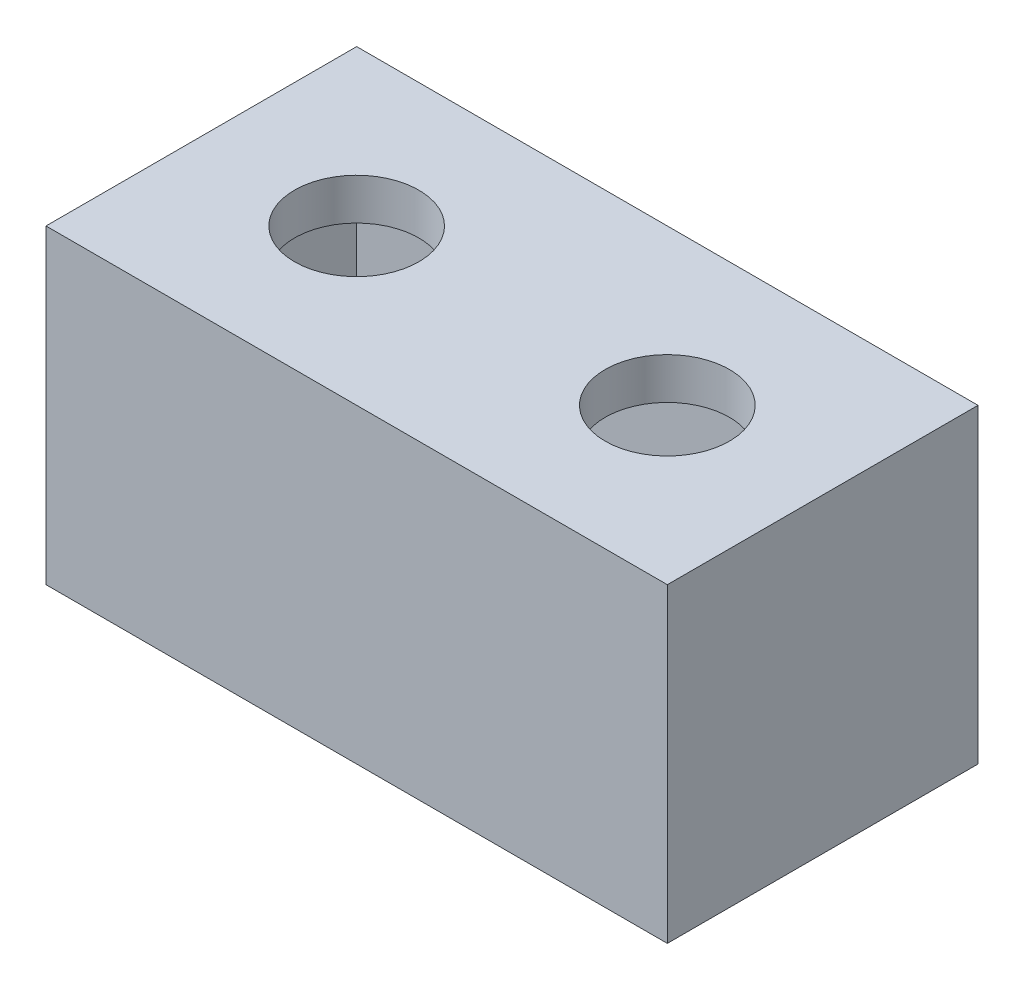
ISO-10303-21;
HEADER;
FILE_DESCRIPTION(('STEP AP214'),'2;1');
FILE_NAME('part.step','',(''),(''),'','','');
FILE_SCHEMA(('AUTOMOTIVE_DESIGN { 1 0 10303 214 1 1 1 1 }'));
ENDSEC;
DATA;
#1=APPLICATION_CONTEXT('core data for automotive mechanical design processes');
#2=APPLICATION_PROTOCOL_DEFINITION('international standard','automotive_design',2000,#1);
#3=PRODUCT_CONTEXT('',#1,'mechanical');
#4=PRODUCT('Part','Part','',(#3));
#5=PRODUCT_RELATED_PRODUCT_CATEGORY('part','',(#4));
#6=PRODUCT_DEFINITION_FORMATION('','',#4);
#7=PRODUCT_DEFINITION_CONTEXT('part definition',#1,'design');
#8=PRODUCT_DEFINITION('design','',#6,#7);
#9=PRODUCT_DEFINITION_SHAPE('','',#8);
#10=(LENGTH_UNIT() NAMED_UNIT(*) SI_UNIT(.MILLI.,.METRE.));
#11=(NAMED_UNIT(*) PLANE_ANGLE_UNIT() SI_UNIT($,.RADIAN.));
#12=(NAMED_UNIT(*) SI_UNIT($,.STERADIAN.) SOLID_ANGLE_UNIT());
#13=UNCERTAINTY_MEASURE_WITH_UNIT(LENGTH_MEASURE(1.E-05),#10,'distance_accuracy_value','');
#14=(GEOMETRIC_REPRESENTATION_CONTEXT(3) GLOBAL_UNCERTAINTY_ASSIGNED_CONTEXT((#13)) GLOBAL_UNIT_ASSIGNED_CONTEXT((#10,
#11,#12)) REPRESENTATION_CONTEXT('',''));
#15=CARTESIAN_POINT('',(0.,0.,0.));
#16=DIRECTION('',(0.,0.,1.));
#17=DIRECTION('',(1.,0.,0.));
#18=AXIS2_PLACEMENT_3D('',#15,#16,#17);
#19=CARTESIAN_POINT('',(0.,15.,0.));
#20=DIRECTION('',(-1.,0.,0.));
#21=DIRECTION('',(0.,0.,1.));
#22=AXIS2_PLACEMENT_3D('',#19,#20,#21);
#23=PLANE('',#22);
#24=DIRECTION('',(0.,0.,-1.));
#25=VECTOR('',#24,1.);
#26=CARTESIAN_POINT('',(0.,0.,0.));
#27=LINE('',#26,#25);
#28=CARTESIAN_POINT('',(0.,0.,0.));
#29=VERTEX_POINT('',#28);
#30=CARTESIAN_POINT('',(0.,0.,-15.));
#31=VERTEX_POINT('',#30);
#32=EDGE_CURVE('E128',#29,#31,#27,.T.);
#33=ORIENTED_EDGE('',*,*,#32,.F.);
#34=DIRECTION('',(0.,-1.,0.));
#35=VECTOR('',#34,1.);
#36=CARTESIAN_POINT('',(0.,15.,0.));
#37=LINE('',#36,#35);
#38=CARTESIAN_POINT('',(0.,15.,0.));
#39=VERTEX_POINT('',#38);
#40=EDGE_CURVE('E40',#39,#29,#37,.T.);
#41=ORIENTED_EDGE('',*,*,#40,.F.);
#42=DIRECTION('',(0.,0.,-1.));
#43=VECTOR('',#42,1.);
#44=CARTESIAN_POINT('',(0.,15.,0.));
#45=LINE('',#44,#43);
#46=CARTESIAN_POINT('',(0.,15.,-15.));
#47=VERTEX_POINT('',#46);
#48=EDGE_CURVE('E138',#39,#47,#45,.T.);
#49=ORIENTED_EDGE('',*,*,#48,.T.);
#50=DIRECTION('',(0.,-1.,0.));
#51=VECTOR('',#50,1.);
#52=CARTESIAN_POINT('',(0.,15.,-15.));
#53=LINE('',#52,#51);
#54=EDGE_CURVE('E145',#47,#31,#53,.T.);
#55=ORIENTED_EDGE('',*,*,#54,.T.);
#56=EDGE_LOOP('',(#33,#41,#49,#55));
#57=FACE_BOUND('',#56,.T.);
#58=ADVANCED_FACE('F33',(#57),#23,.T.);
#59=CARTESIAN_POINT('',(0.,15.,0.));
#60=DIRECTION('',(0.,0.,-1.));
#61=DIRECTION('',(-1.,0.,0.));
#62=AXIS2_PLACEMENT_3D('',#59,#60,#61);
#63=PLANE('',#62);
#64=DIRECTION('',(1.,0.,0.));
#65=VECTOR('',#64,1.);
#66=CARTESIAN_POINT('',(0.,0.,0.));
#67=LINE('',#66,#65);
#68=CARTESIAN_POINT('',(30.,0.,0.));
#69=VERTEX_POINT('',#68);
#70=EDGE_CURVE('E132',#29,#69,#67,.T.);
#71=ORIENTED_EDGE('',*,*,#70,.T.);
#72=DIRECTION('',(0.,-1.,0.));
#73=VECTOR('',#72,1.);
#74=CARTESIAN_POINT('',(30.,15.,0.));
#75=LINE('',#74,#73);
#76=CARTESIAN_POINT('',(30.,15.,0.));
#77=VERTEX_POINT('',#76);
#78=EDGE_CURVE('E140',#77,#69,#75,.T.);
#79=ORIENTED_EDGE('',*,*,#78,.F.);
#80=DIRECTION('',(1.,0.,0.));
#81=VECTOR('',#80,1.);
#82=CARTESIAN_POINT('',(0.,15.,0.));
#83=LINE('',#82,#81);
#84=EDGE_CURVE('E147',#39,#77,#83,.T.);
#85=ORIENTED_EDGE('',*,*,#84,.F.);
#86=ORIENTED_EDGE('',*,*,#40,.T.);
#87=EDGE_LOOP('',(#71,#79,#85,#86));
#88=FACE_BOUND('',#87,.T.);
#89=ADVANCED_FACE('F194',(#88),#63,.F.);
#90=CARTESIAN_POINT('',(30.,15.,0.));
#91=DIRECTION('',(-1.,0.,0.));
#92=DIRECTION('',(0.,0.,1.));
#93=AXIS2_PLACEMENT_3D('',#90,#91,#92);
#94=PLANE('',#93);
#95=DIRECTION('',(0.,0.,-1.));
#96=VECTOR('',#95,1.);
#97=CARTESIAN_POINT('',(30.,0.,0.));
#98=LINE('',#97,#96);
#99=CARTESIAN_POINT('',(30.,0.,-15.));
#100=VERTEX_POINT('',#99);
#101=EDGE_CURVE('E129',#69,#100,#98,.T.);
#102=ORIENTED_EDGE('',*,*,#101,.T.);
#103=DIRECTION('',(0.,-1.,0.));
#104=VECTOR('',#103,1.);
#105=CARTESIAN_POINT('',(30.,15.,-15.));
#106=LINE('',#105,#104);
#107=CARTESIAN_POINT('',(30.,15.,-15.));
#108=VERTEX_POINT('',#107);
#109=EDGE_CURVE('E143',#108,#100,#106,.T.);
#110=ORIENTED_EDGE('',*,*,#109,.F.);
#111=DIRECTION('',(0.,0.,-1.));
#112=VECTOR('',#111,1.);
#113=CARTESIAN_POINT('',(30.,15.,0.));
#114=LINE('',#113,#112);
#115=EDGE_CURVE('E184',#77,#108,#114,.T.);
#116=ORIENTED_EDGE('',*,*,#115,.F.);
#117=ORIENTED_EDGE('',*,*,#78,.T.);
#118=EDGE_LOOP('',(#102,#110,#116,#117));
#119=FACE_BOUND('',#118,.T.);
#120=ADVANCED_FACE('F197',(#119),#94,.F.);
#121=CARTESIAN_POINT('',(0.,15.,-15.));
#122=DIRECTION('',(0.,0.,-1.));
#123=DIRECTION('',(-1.,0.,0.));
#124=AXIS2_PLACEMENT_3D('',#121,#122,#123);
#125=PLANE('',#124);
#126=CARTESIAN_POINT('',(15.,0.,-15.));
#127=DIRECTION('',(0.,0.,-1.));
#128=DIRECTION('',(-1.,0.,0.));
#129=AXIS2_PLACEMENT_3D('',#126,#127,#128);
#130=CIRCLE('',#129,5.);
#131=CARTESIAN_POINT('',(10.,0.,-15.));
#132=VERTEX_POINT('',#131);
#133=CARTESIAN_POINT('',(20.,0.,-15.));
#134=VERTEX_POINT('',#133);
#135=EDGE_CURVE('E109',#132,#134,#130,.T.);
#136=ORIENTED_EDGE('',*,*,#135,.F.);
#137=DIRECTION('',(1.,0.,0.));
#138=VECTOR('',#137,1.);
#139=CARTESIAN_POINT('',(0.,0.,-15.));
#140=LINE('',#139,#138);
#141=EDGE_CURVE('E120',#31,#132,#140,.T.);
#142=ORIENTED_EDGE('',*,*,#141,.F.);
#143=ORIENTED_EDGE('',*,*,#54,.F.);
#144=DIRECTION('',(1.,0.,0.));
#145=VECTOR('',#144,1.);
#146=CARTESIAN_POINT('',(0.,15.,-15.));
#147=LINE('',#146,#145);
#148=EDGE_CURVE('E181',#47,#108,#147,.T.);
#149=ORIENTED_EDGE('',*,*,#148,.T.);
#150=ORIENTED_EDGE('',*,*,#109,.T.);
#151=EDGE_CURVE('E123',#134,#100,#140,.T.);
#152=ORIENTED_EDGE('',*,*,#151,.F.);
#153=EDGE_LOOP('',(#136,#142,#143,#149,#150,#152));
#154=FACE_BOUND('',#153,.T.);
#155=ADVANCED_FACE('F119',(#154),#125,.T.);
#156=CARTESIAN_POINT('',(0.,15.,0.));
#157=DIRECTION('',(0.,-1.,0.));
#158=DIRECTION('',(0.,0.,-1.));
#159=AXIS2_PLACEMENT_3D('',#156,#157,#158);
#160=PLANE('',#159);
#161=CARTESIAN_POINT('',(7.5,15.,-7.5));
#162=DIRECTION('',(0.,1.,0.));
#163=DIRECTION('',(0.,0.,1.));
#164=AXIS2_PLACEMENT_3D('',#161,#162,#163);
#165=CIRCLE('',#164,3.);
#166=CARTESIAN_POINT('',(7.5,15.,-4.5));
#167=VERTEX_POINT('',#166);
#168=EDGE_CURVE('E151',#167,#167,#165,.T.);
#169=ORIENTED_EDGE('',*,*,#168,.F.);
#170=EDGE_LOOP('',(#169));
#171=FACE_BOUND('',#170,.T.);
#172=CARTESIAN_POINT('',(22.5,15.,-7.5));
#173=DIRECTION('',(0.,1.,0.));
#174=DIRECTION('',(0.,0.,1.));
#175=AXIS2_PLACEMENT_3D('',#172,#173,#174);
#176=CIRCLE('',#175,3.);
#177=CARTESIAN_POINT('',(22.5,15.,-4.5));
#178=VERTEX_POINT('',#177);
#179=EDGE_CURVE('E114',#178,#178,#176,.T.);
#180=ORIENTED_EDGE('',*,*,#179,.F.);
#181=EDGE_LOOP('',(#180));
#182=FACE_BOUND('',#181,.T.);
#183=ORIENTED_EDGE('',*,*,#48,.F.);
#184=ORIENTED_EDGE('',*,*,#84,.T.);
#185=ORIENTED_EDGE('',*,*,#115,.T.);
#186=ORIENTED_EDGE('',*,*,#148,.F.);
#187=EDGE_LOOP('',(#183,#184,#185,#186));
#188=FACE_BOUND('',#187,.T.);
#189=ADVANCED_FACE('F189',(#171,#182,#188),#160,.F.);
#190=CARTESIAN_POINT('',(0.,0.,0.));
#191=DIRECTION('',(0.,-1.,0.));
#192=DIRECTION('',(0.,0.,-1.));
#193=AXIS2_PLACEMENT_3D('',#190,#191,#192);
#194=PLANE('',#193);
#195=DIRECTION('',(0.,0.,-1.));
#196=VECTOR('',#195,1.);
#197=CARTESIAN_POINT('',(10.,0.,-10.));
#198=LINE('',#197,#196);
#199=CARTESIAN_POINT('',(10.,0.,-13.));
#200=VERTEX_POINT('',#199);
#201=EDGE_CURVE('E106',#200,#132,#198,.T.);
#202=ORIENTED_EDGE('',*,*,#201,.F.);
#203=DIRECTION('',(1.,0.,0.));
#204=VECTOR('',#203,1.);
#205=CARTESIAN_POINT('',(2.,0.,-13.));
#206=LINE('',#205,#204);
#207=CARTESIAN_POINT('',(2.,0.,-13.));
#208=VERTEX_POINT('',#207);
#209=EDGE_CURVE('E157',#208,#200,#206,.T.);
#210=ORIENTED_EDGE('',*,*,#209,.F.);
#211=DIRECTION('',(0.,0.,-1.));
#212=VECTOR('',#211,1.);
#213=CARTESIAN_POINT('',(2.,0.,-2.));
#214=LINE('',#213,#212);
#215=CARTESIAN_POINT('',(2.,0.,-2.));
#216=VERTEX_POINT('',#215);
#217=EDGE_CURVE('E54',#216,#208,#214,.T.);
#218=ORIENTED_EDGE('',*,*,#217,.F.);
#219=DIRECTION('',(-1.,0.,0.));
#220=VECTOR('',#219,1.);
#221=CARTESIAN_POINT('',(2.,0.,-2.));
#222=LINE('',#221,#220);
#223=CARTESIAN_POINT('',(28.,0.,-2.));
#224=VERTEX_POINT('',#223);
#225=EDGE_CURVE('E166',#224,#216,#222,.T.);
#226=ORIENTED_EDGE('',*,*,#225,.F.);
#227=DIRECTION('',(0.,0.,1.));
#228=VECTOR('',#227,1.);
#229=CARTESIAN_POINT('',(28.,0.,-2.));
#230=LINE('',#229,#228);
#231=CARTESIAN_POINT('',(28.,0.,-13.));
#232=VERTEX_POINT('',#231);
#233=EDGE_CURVE('E163',#232,#224,#230,.T.);
#234=ORIENTED_EDGE('',*,*,#233,.F.);
#235=CARTESIAN_POINT('',(20.,0.,-13.));
#236=VERTEX_POINT('',#235);
#237=EDGE_CURVE('E155',#236,#232,#206,.T.);
#238=ORIENTED_EDGE('',*,*,#237,.F.);
#239=DIRECTION('',(0.,0.,-1.));
#240=VECTOR('',#239,1.);
#241=CARTESIAN_POINT('',(20.,0.,-10.));
#242=LINE('',#241,#240);
#243=EDGE_CURVE('E47',#134,#236,#242,.F.);
#244=ORIENTED_EDGE('',*,*,#243,.F.);
#245=ORIENTED_EDGE('',*,*,#151,.T.);
#246=ORIENTED_EDGE('',*,*,#101,.F.);
#247=ORIENTED_EDGE('',*,*,#70,.F.);
#248=ORIENTED_EDGE('',*,*,#32,.T.);
#249=ORIENTED_EDGE('',*,*,#141,.T.);
#250=EDGE_LOOP('',(#202,#210,#218,#226,#234,#238,#244,#245,#246,#247,#248,#249));
#251=FACE_BOUND('',#250,.T.);
#252=ADVANCED_FACE('F125',(#251),#194,.T.);
#253=CARTESIAN_POINT('',(2.,13.,-2.));
#254=DIRECTION('',(-1.,0.,0.));
#255=DIRECTION('',(0.,0.,1.));
#256=AXIS2_PLACEMENT_3D('',#253,#254,#255);
#257=PLANE('',#256);
#258=ORIENTED_EDGE('',*,*,#217,.T.);
#259=DIRECTION('',(0.,-1.,0.));
#260=VECTOR('',#259,1.);
#261=CARTESIAN_POINT('',(2.,13.,-13.));
#262=LINE('',#261,#260);
#263=CARTESIAN_POINT('',(2.,13.,-13.));
#264=VERTEX_POINT('',#263);
#265=EDGE_CURVE('E177',#264,#208,#262,.T.);
#266=ORIENTED_EDGE('',*,*,#265,.F.);
#267=DIRECTION('',(0.,0.,-1.));
#268=VECTOR('',#267,1.);
#269=CARTESIAN_POINT('',(2.,13.,-2.));
#270=LINE('',#269,#268);
#271=CARTESIAN_POINT('',(2.,13.,-2.));
#272=VERTEX_POINT('',#271);
#273=EDGE_CURVE('E169',#272,#264,#270,.T.);
#274=ORIENTED_EDGE('',*,*,#273,.F.);
#275=DIRECTION('',(0.,-1.,0.));
#276=VECTOR('',#275,1.);
#277=CARTESIAN_POINT('',(2.,13.,-2.));
#278=LINE('',#277,#276);
#279=EDGE_CURVE('E170',#272,#216,#278,.T.);
#280=ORIENTED_EDGE('',*,*,#279,.T.);
#281=EDGE_LOOP('',(#258,#266,#274,#280));
#282=FACE_BOUND('',#281,.T.);
#283=ADVANCED_FACE('F222',(#282),#257,.F.);
#284=CARTESIAN_POINT('',(2.,13.,-2.));
#285=DIRECTION('',(0.,0.,1.));
#286=DIRECTION('',(1.,0.,0.));
#287=AXIS2_PLACEMENT_3D('',#284,#285,#286);
#288=PLANE('',#287);
#289=ORIENTED_EDGE('',*,*,#225,.T.);
#290=ORIENTED_EDGE('',*,*,#279,.F.);
#291=DIRECTION('',(-1.,0.,0.));
#292=VECTOR('',#291,1.);
#293=CARTESIAN_POINT('',(2.,13.,-2.));
#294=LINE('',#293,#292);
#295=CARTESIAN_POINT('',(28.,13.,-2.));
#296=VERTEX_POINT('',#295);
#297=EDGE_CURVE('E160',#296,#272,#294,.T.);
#298=ORIENTED_EDGE('',*,*,#297,.F.);
#299=DIRECTION('',(0.,-1.,0.));
#300=VECTOR('',#299,1.);
#301=CARTESIAN_POINT('',(28.,13.,-2.));
#302=LINE('',#301,#300);
#303=EDGE_CURVE('E172',#296,#224,#302,.T.);
#304=ORIENTED_EDGE('',*,*,#303,.T.);
#305=EDGE_LOOP('',(#289,#290,#298,#304));
#306=FACE_BOUND('',#305,.T.);
#307=ADVANCED_FACE('F220',(#306),#288,.F.);
#308=CARTESIAN_POINT('',(28.,13.,-2.));
#309=DIRECTION('',(1.,0.,0.));
#310=DIRECTION('',(0.,0.,-1.));
#311=AXIS2_PLACEMENT_3D('',#308,#309,#310);
#312=PLANE('',#311);
#313=ORIENTED_EDGE('',*,*,#233,.T.);
#314=ORIENTED_EDGE('',*,*,#303,.F.);
#315=DIRECTION('',(0.,0.,1.));
#316=VECTOR('',#315,1.);
#317=CARTESIAN_POINT('',(28.,13.,-2.));
#318=LINE('',#317,#316);
#319=CARTESIAN_POINT('',(28.,13.,-13.));
#320=VERTEX_POINT('',#319);
#321=EDGE_CURVE('E211',#320,#296,#318,.T.);
#322=ORIENTED_EDGE('',*,*,#321,.F.);
#323=DIRECTION('',(0.,-1.,0.));
#324=VECTOR('',#323,1.);
#325=CARTESIAN_POINT('',(28.,13.,-13.));
#326=LINE('',#325,#324);
#327=EDGE_CURVE('E174',#320,#232,#326,.T.);
#328=ORIENTED_EDGE('',*,*,#327,.T.);
#329=EDGE_LOOP('',(#313,#314,#322,#328));
#330=FACE_BOUND('',#329,.T.);
#331=ADVANCED_FACE('F227',(#330),#312,.F.);
#332=CARTESIAN_POINT('',(2.,13.,-13.));
#333=DIRECTION('',(0.,0.,-1.));
#334=DIRECTION('',(-1.,0.,0.));
#335=AXIS2_PLACEMENT_3D('',#332,#333,#334);
#336=PLANE('',#335);
#337=ORIENTED_EDGE('',*,*,#209,.T.);
#338=CARTESIAN_POINT('',(15.,0.,-13.));
#339=DIRECTION('',(0.,0.,-1.));
#340=DIRECTION('',(-1.,0.,0.));
#341=AXIS2_PLACEMENT_3D('',#338,#339,#340);
#342=CIRCLE('',#341,5.);
#343=EDGE_CURVE('E11',#200,#236,#342,.T.);
#344=ORIENTED_EDGE('',*,*,#343,.T.);
#345=ORIENTED_EDGE('',*,*,#237,.T.);
#346=ORIENTED_EDGE('',*,*,#327,.F.);
#347=DIRECTION('',(1.,0.,0.));
#348=VECTOR('',#347,1.);
#349=CARTESIAN_POINT('',(2.,13.,-13.));
#350=LINE('',#349,#348);
#351=EDGE_CURVE('E209',#264,#320,#350,.T.);
#352=ORIENTED_EDGE('',*,*,#351,.F.);
#353=ORIENTED_EDGE('',*,*,#265,.T.);
#354=EDGE_LOOP('',(#337,#344,#345,#346,#352,#353));
#355=FACE_BOUND('',#354,.T.);
#356=ADVANCED_FACE('F225',(#355),#336,.F.);
#357=CARTESIAN_POINT('',(0.,13.,0.));
#358=DIRECTION('',(0.,-1.,0.));
#359=DIRECTION('',(0.,0.,-1.));
#360=AXIS2_PLACEMENT_3D('',#357,#358,#359);
#361=PLANE('',#360);
#362=CARTESIAN_POINT('',(7.5,13.,-7.5));
#363=DIRECTION('',(0.,-1.,0.));
#364=DIRECTION('',(0.,0.,-1.));
#365=AXIS2_PLACEMENT_3D('',#362,#363,#364);
#366=CIRCLE('',#365,3.);
#367=CARTESIAN_POINT('',(7.5,13.,-4.5));
#368=VERTEX_POINT('',#367);
#369=EDGE_CURVE('E150',#368,#368,#366,.T.);
#370=ORIENTED_EDGE('',*,*,#369,.F.);
#371=EDGE_LOOP('',(#370));
#372=FACE_BOUND('',#371,.T.);
#373=CARTESIAN_POINT('',(22.5,13.,-7.5));
#374=DIRECTION('',(0.,-1.,0.));
#375=DIRECTION('',(0.,0.,-1.));
#376=AXIS2_PLACEMENT_3D('',#373,#374,#375);
#377=CIRCLE('',#376,3.);
#378=CARTESIAN_POINT('',(22.5,13.,-4.5));
#379=VERTEX_POINT('',#378);
#380=EDGE_CURVE('E148',#379,#379,#377,.T.);
#381=ORIENTED_EDGE('',*,*,#380,.F.);
#382=EDGE_LOOP('',(#381));
#383=FACE_BOUND('',#382,.T.);
#384=ORIENTED_EDGE('',*,*,#273,.T.);
#385=ORIENTED_EDGE('',*,*,#351,.T.);
#386=ORIENTED_EDGE('',*,*,#321,.T.);
#387=ORIENTED_EDGE('',*,*,#297,.T.);
#388=EDGE_LOOP('',(#384,#385,#386,#387));
#389=FACE_BOUND('',#388,.T.);
#390=ADVANCED_FACE('F217',(#372,#383,#389),#361,.T.);
#391=CARTESIAN_POINT('',(22.5,2.,-7.5));
#392=DIRECTION('',(0.,1.,0.));
#393=DIRECTION('',(0.,0.,1.));
#394=AXIS2_PLACEMENT_3D('',#391,#392,#393);
#395=CYLINDRICAL_SURFACE('',#394,3.);
#396=CARTESIAN_POINT('',(22.5,13.,-4.5));
#397=CARTESIAN_POINT('',(22.5,13.0208333333333,-4.5));
#398=CARTESIAN_POINT('',(22.5,13.0416666666667,-4.5));
#399=CARTESIAN_POINT('',(22.5,13.0833333333333,-4.5));
#400=CARTESIAN_POINT('',(22.5,13.1041666666667,-4.5));
#401=CARTESIAN_POINT('',(22.5,13.1458333333333,-4.5));
#402=CARTESIAN_POINT('',(22.5,13.1666666666667,-4.5));
#403=CARTESIAN_POINT('',(22.5,13.2083333333333,-4.5));
#404=CARTESIAN_POINT('',(22.5,13.2291666666667,-4.5));
#405=CARTESIAN_POINT('',(22.5,13.2708333333333,-4.5));
#406=CARTESIAN_POINT('',(22.5,13.2916666666667,-4.5));
#407=CARTESIAN_POINT('',(22.5,13.3333333333333,-4.5));
#408=CARTESIAN_POINT('',(22.5,13.3541666666667,-4.5));
#409=CARTESIAN_POINT('',(22.5,13.3958333333333,-4.5));
#410=CARTESIAN_POINT('',(22.5,13.4166666666667,-4.5));
#411=CARTESIAN_POINT('',(22.5,13.4583333333333,-4.5));
#412=CARTESIAN_POINT('',(22.5,13.4791666666667,-4.5));
#413=CARTESIAN_POINT('',(22.5,13.5208333333333,-4.5));
#414=CARTESIAN_POINT('',(22.5,13.5416666666667,-4.5));
#415=CARTESIAN_POINT('',(22.5,13.5833333333333,-4.5));
#416=CARTESIAN_POINT('',(22.5,13.6041666666667,-4.5));
#417=CARTESIAN_POINT('',(22.5,13.6458333333333,-4.5));
#418=CARTESIAN_POINT('',(22.5,13.6666666666667,-4.5));
#419=CARTESIAN_POINT('',(22.5,13.7083333333333,-4.5));
#420=CARTESIAN_POINT('',(22.5,13.7291666666667,-4.5));
#421=CARTESIAN_POINT('',(22.5,13.7708333333333,-4.5));
#422=CARTESIAN_POINT('',(22.5,13.7916666666667,-4.5));
#423=CARTESIAN_POINT('',(22.5,13.8333333333333,-4.5));
#424=CARTESIAN_POINT('',(22.5,13.8541666666667,-4.5));
#425=CARTESIAN_POINT('',(22.5,13.8958333333333,-4.5));
#426=CARTESIAN_POINT('',(22.5,13.9166666666667,-4.5));
#427=CARTESIAN_POINT('',(22.5,13.9583333333333,-4.5));
#428=CARTESIAN_POINT('',(22.5,13.9791666666667,-4.5));
#429=CARTESIAN_POINT('',(22.5,14.0208333333333,-4.5));
#430=CARTESIAN_POINT('',(22.5,14.0416666666667,-4.5));
#431=CARTESIAN_POINT('',(22.5,14.0833333333333,-4.5));
#432=CARTESIAN_POINT('',(22.5,14.1041666666667,-4.5));
#433=CARTESIAN_POINT('',(22.5,14.1458333333333,-4.5));
#434=CARTESIAN_POINT('',(22.5,14.1666666666667,-4.5));
#435=CARTESIAN_POINT('',(22.5,14.2083333333333,-4.5));
#436=CARTESIAN_POINT('',(22.5,14.2291666666667,-4.5));
#437=CARTESIAN_POINT('',(22.5,14.2708333333333,-4.5));
#438=CARTESIAN_POINT('',(22.5,14.2916666666667,-4.5));
#439=CARTESIAN_POINT('',(22.5,14.3333333333333,-4.5));
#440=CARTESIAN_POINT('',(22.5,14.3541666666667,-4.5));
#441=CARTESIAN_POINT('',(22.5,14.3958333333333,-4.5));
#442=CARTESIAN_POINT('',(22.5,14.4166666666667,-4.5));
#443=CARTESIAN_POINT('',(22.5,14.4583333333333,-4.5));
#444=CARTESIAN_POINT('',(22.5,14.4791666666667,-4.5));
#445=CARTESIAN_POINT('',(22.5,14.5208333333333,-4.5));
#446=CARTESIAN_POINT('',(22.5,14.5416666666667,-4.5));
#447=CARTESIAN_POINT('',(22.5,14.5833333333333,-4.5));
#448=CARTESIAN_POINT('',(22.5,14.6041666666667,-4.5));
#449=CARTESIAN_POINT('',(22.5,14.6458333333333,-4.5));
#450=CARTESIAN_POINT('',(22.5,14.6666666666667,-4.5));
#451=CARTESIAN_POINT('',(22.5,14.7083333333333,-4.5));
#452=CARTESIAN_POINT('',(22.5,14.7291666666667,-4.5));
#453=CARTESIAN_POINT('',(22.5,14.7708333333333,-4.5));
#454=CARTESIAN_POINT('',(22.5,14.7916666666667,-4.5));
#455=CARTESIAN_POINT('',(22.5,14.8333333333333,-4.5));
#456=CARTESIAN_POINT('',(22.5,14.8541666666667,-4.5));
#457=CARTESIAN_POINT('',(22.5,14.8958333333333,-4.5));
#458=CARTESIAN_POINT('',(22.5,14.9166666666667,-4.5));
#459=CARTESIAN_POINT('',(22.5,14.9583333333333,-4.5));
#460=CARTESIAN_POINT('',(22.5,14.9791666666667,-4.5));
#461=CARTESIAN_POINT('',(22.5,15.,-4.5));
#462=B_SPLINE_CURVE_WITH_KNOTS('',3,(#396,#397,#398,#399,#400,#401,#402,#403,#404,#405,#406,
#407,#408,#409,#410,#411,#412,#413,#414,#415,#416,#417,#418,#419,#420,#421,#422,#423,#424,#425,
#426,#427,#428,#429,#430,#431,#432,#433,#434,#435,#436,#437,#438,#439,#440,#441,#442,#443,#444,
#445,#446,#447,#448,#449,#450,#451,#452,#453,#454,#455,#456,#457,#458,#459,#460,#461),
.UNSPECIFIED.,.F.,.F.,(4,2,2,2,2,2,2,2,2,2,2,2,2,2,2,2,2,2,2,2,2,2,2,2,2,2,2,2,2,2,2,2,4),(0.,
0.0625000000000001,0.125,0.1875,0.25,0.3125,0.375,0.4375,0.5,0.562499999999999,
0.624999999999999,0.687499999999999,0.749999999999999,0.812499999999999,0.874999999999999,
0.937499999999999,0.999999999999999,1.0625,1.125,1.1875,1.25,1.3125,1.375,1.4375,1.5,1.5625,
1.625,1.6875,1.75,1.8125,1.875,1.9375,2.),.UNSPECIFIED.);
#463=EDGE_CURVE('BSEAM288',#379,#178,#462,.T.);
#464=ORIENTED_EDGE('',*,*,#380,.T.);
#465=ORIENTED_EDGE('',*,*,#179,.T.);
#466=ORIENTED_EDGE('',*,*,#463,.T.);
#467=ORIENTED_EDGE('',*,*,#463,.F.);
#468=EDGE_LOOP('',(#464,#466,#465,#467));
#469=FACE_BOUND('',#468,.T.);
#470=ADVANCED_FACE('F288',(#469),#395,.F.);
#471=CARTESIAN_POINT('',(7.5,2.,-7.5));
#472=DIRECTION('',(0.,1.,0.));
#473=DIRECTION('',(0.,0.,1.));
#474=AXIS2_PLACEMENT_3D('',#471,#472,#473);
#475=CYLINDRICAL_SURFACE('',#474,3.);
#476=CARTESIAN_POINT('',(7.5,13.,-4.5));
#477=CARTESIAN_POINT('',(7.5,13.0208333333333,-4.5));
#478=CARTESIAN_POINT('',(7.5,13.0416666666667,-4.5));
#479=CARTESIAN_POINT('',(7.5,13.0833333333333,-4.5));
#480=CARTESIAN_POINT('',(7.5,13.1041666666667,-4.5));
#481=CARTESIAN_POINT('',(7.5,13.1458333333333,-4.5));
#482=CARTESIAN_POINT('',(7.5,13.1666666666667,-4.5));
#483=CARTESIAN_POINT('',(7.5,13.2083333333333,-4.5));
#484=CARTESIAN_POINT('',(7.5,13.2291666666667,-4.5));
#485=CARTESIAN_POINT('',(7.5,13.2708333333333,-4.5));
#486=CARTESIAN_POINT('',(7.5,13.2916666666667,-4.5));
#487=CARTESIAN_POINT('',(7.5,13.3333333333333,-4.5));
#488=CARTESIAN_POINT('',(7.5,13.3541666666667,-4.5));
#489=CARTESIAN_POINT('',(7.5,13.3958333333333,-4.5));
#490=CARTESIAN_POINT('',(7.5,13.4166666666667,-4.5));
#491=CARTESIAN_POINT('',(7.5,13.4583333333333,-4.5));
#492=CARTESIAN_POINT('',(7.5,13.4791666666667,-4.5));
#493=CARTESIAN_POINT('',(7.5,13.5208333333333,-4.5));
#494=CARTESIAN_POINT('',(7.5,13.5416666666667,-4.5));
#495=CARTESIAN_POINT('',(7.5,13.5833333333333,-4.5));
#496=CARTESIAN_POINT('',(7.5,13.6041666666667,-4.5));
#497=CARTESIAN_POINT('',(7.5,13.6458333333333,-4.5));
#498=CARTESIAN_POINT('',(7.5,13.6666666666667,-4.5));
#499=CARTESIAN_POINT('',(7.5,13.7083333333333,-4.5));
#500=CARTESIAN_POINT('',(7.5,13.7291666666667,-4.5));
#501=CARTESIAN_POINT('',(7.5,13.7708333333333,-4.5));
#502=CARTESIAN_POINT('',(7.5,13.7916666666667,-4.5));
#503=CARTESIAN_POINT('',(7.5,13.8333333333333,-4.5));
#504=CARTESIAN_POINT('',(7.5,13.8541666666667,-4.5));
#505=CARTESIAN_POINT('',(7.5,13.8958333333333,-4.5));
#506=CARTESIAN_POINT('',(7.5,13.9166666666667,-4.5));
#507=CARTESIAN_POINT('',(7.5,13.9583333333333,-4.5));
#508=CARTESIAN_POINT('',(7.5,13.9791666666667,-4.5));
#509=CARTESIAN_POINT('',(7.5,14.0208333333333,-4.5));
#510=CARTESIAN_POINT('',(7.5,14.0416666666667,-4.5));
#511=CARTESIAN_POINT('',(7.5,14.0833333333333,-4.5));
#512=CARTESIAN_POINT('',(7.5,14.1041666666667,-4.5));
#513=CARTESIAN_POINT('',(7.5,14.1458333333333,-4.5));
#514=CARTESIAN_POINT('',(7.5,14.1666666666667,-4.5));
#515=CARTESIAN_POINT('',(7.5,14.2083333333333,-4.5));
#516=CARTESIAN_POINT('',(7.5,14.2291666666667,-4.5));
#517=CARTESIAN_POINT('',(7.5,14.2708333333333,-4.5));
#518=CARTESIAN_POINT('',(7.5,14.2916666666667,-4.5));
#519=CARTESIAN_POINT('',(7.5,14.3333333333333,-4.5));
#520=CARTESIAN_POINT('',(7.5,14.3541666666667,-4.5));
#521=CARTESIAN_POINT('',(7.5,14.3958333333333,-4.5));
#522=CARTESIAN_POINT('',(7.5,14.4166666666667,-4.5));
#523=CARTESIAN_POINT('',(7.5,14.4583333333333,-4.5));
#524=CARTESIAN_POINT('',(7.5,14.4791666666667,-4.5));
#525=CARTESIAN_POINT('',(7.5,14.5208333333333,-4.5));
#526=CARTESIAN_POINT('',(7.5,14.5416666666667,-4.5));
#527=CARTESIAN_POINT('',(7.5,14.5833333333333,-4.5));
#528=CARTESIAN_POINT('',(7.5,14.6041666666667,-4.5));
#529=CARTESIAN_POINT('',(7.5,14.6458333333333,-4.5));
#530=CARTESIAN_POINT('',(7.5,14.6666666666667,-4.5));
#531=CARTESIAN_POINT('',(7.5,14.7083333333333,-4.5));
#532=CARTESIAN_POINT('',(7.5,14.7291666666667,-4.5));
#533=CARTESIAN_POINT('',(7.5,14.7708333333333,-4.5));
#534=CARTESIAN_POINT('',(7.5,14.7916666666667,-4.5));
#535=CARTESIAN_POINT('',(7.5,14.8333333333333,-4.5));
#536=CARTESIAN_POINT('',(7.5,14.8541666666667,-4.5));
#537=CARTESIAN_POINT('',(7.5,14.8958333333333,-4.5));
#538=CARTESIAN_POINT('',(7.5,14.9166666666667,-4.5));
#539=CARTESIAN_POINT('',(7.5,14.9583333333333,-4.5));
#540=CARTESIAN_POINT('',(7.5,14.9791666666667,-4.5));
#541=CARTESIAN_POINT('',(7.5,15.,-4.5));
#542=B_SPLINE_CURVE_WITH_KNOTS('',3,(#476,#477,#478,#479,#480,#481,#482,#483,#484,#485,#486,
#487,#488,#489,#490,#491,#492,#493,#494,#495,#496,#497,#498,#499,#500,#501,#502,#503,#504,#505,
#506,#507,#508,#509,#510,#511,#512,#513,#514,#515,#516,#517,#518,#519,#520,#521,#522,#523,#524,
#525,#526,#527,#528,#529,#530,#531,#532,#533,#534,#535,#536,#537,#538,#539,#540,#541),
.UNSPECIFIED.,.F.,.F.,(4,2,2,2,2,2,2,2,2,2,2,2,2,2,2,2,2,2,2,2,2,2,2,2,2,2,2,2,2,2,2,2,4),(0.,
0.0625000000000001,0.125,0.1875,0.25,0.3125,0.375,0.4375,0.5,0.562499999999999,
0.624999999999999,0.687499999999999,0.749999999999999,0.812499999999999,0.874999999999999,
0.937499999999999,0.999999999999999,1.0625,1.125,1.1875,1.25,1.3125,1.375,1.4375,1.5,1.5625,
1.625,1.6875,1.75,1.8125,1.875,1.9375,2.),.UNSPECIFIED.);
#543=EDGE_CURVE('BSEAM298',#368,#167,#542,.T.);
#544=ORIENTED_EDGE('',*,*,#369,.T.);
#545=ORIENTED_EDGE('',*,*,#168,.T.);
#546=ORIENTED_EDGE('',*,*,#543,.T.);
#547=ORIENTED_EDGE('',*,*,#543,.F.);
#548=EDGE_LOOP('',(#544,#546,#545,#547));
#549=FACE_BOUND('',#548,.T.);
#550=ADVANCED_FACE('F298',(#549),#475,.F.);
#551=CARTESIAN_POINT('',(15.,0.,-10.));
#552=DIRECTION('',(0.,0.,-1.));
#553=DIRECTION('',(-1.,0.,0.));
#554=AXIS2_PLACEMENT_3D('',#551,#552,#553);
#555=CYLINDRICAL_SURFACE('',#554,5.);
#556=ORIENTED_EDGE('',*,*,#201,.T.);
#557=ORIENTED_EDGE('',*,*,#135,.T.);
#558=ORIENTED_EDGE('',*,*,#243,.T.);
#559=ORIENTED_EDGE('',*,*,#343,.F.);
#560=EDGE_LOOP('',(#556,#557,#558,#559));
#561=FACE_BOUND('',#560,.T.);
#562=ADVANCED_FACE('F108',(#561),#555,.F.);
#563=CLOSED_SHELL('',(#58,#89,#120,#155,#189,#252,#283,#307,#331,#356,#390,#470,#550,#562));
#564=MANIFOLD_SOLID_BREP('B2',#563);
#565=ADVANCED_BREP_SHAPE_REPRESENTATION('',(#18,#564),#14);
#566=SHAPE_DEFINITION_REPRESENTATION(#9,#565);
ENDSEC;
END-ISO-10303-21;
